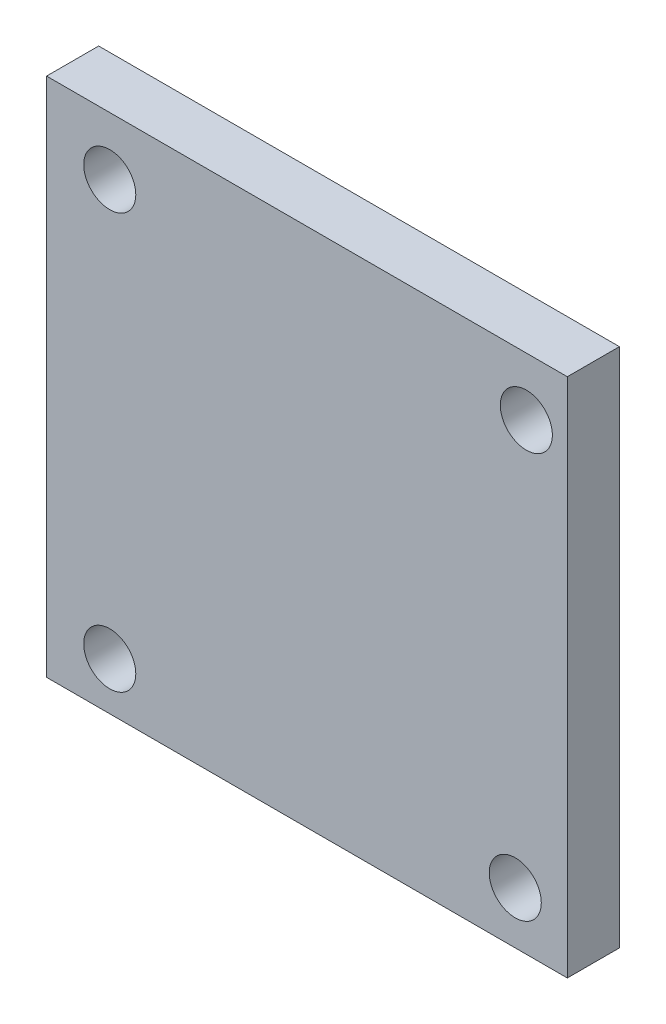
ISO-10303-21;
HEADER;
FILE_DESCRIPTION(('STEP AP214'),'2;1');
FILE_NAME('part.step','',(''),(''),'','','');
FILE_SCHEMA(('AUTOMOTIVE_DESIGN { 1 0 10303 214 1 1 1 1 }'));
ENDSEC;
DATA;
#1=APPLICATION_CONTEXT('core data for automotive mechanical design processes');
#2=APPLICATION_PROTOCOL_DEFINITION('international standard','automotive_design',2000,#1);
#3=PRODUCT_CONTEXT('',#1,'mechanical');
#4=PRODUCT('Part','Part','',(#3));
#5=PRODUCT_RELATED_PRODUCT_CATEGORY('part','',(#4));
#6=PRODUCT_DEFINITION_FORMATION('','',#4);
#7=PRODUCT_DEFINITION_CONTEXT('part definition',#1,'design');
#8=PRODUCT_DEFINITION('design','',#6,#7);
#9=PRODUCT_DEFINITION_SHAPE('','',#8);
#10=(LENGTH_UNIT() NAMED_UNIT(*) SI_UNIT(.MILLI.,.METRE.));
#11=(NAMED_UNIT(*) PLANE_ANGLE_UNIT() SI_UNIT($,.RADIAN.));
#12=(NAMED_UNIT(*) SI_UNIT($,.STERADIAN.) SOLID_ANGLE_UNIT());
#13=UNCERTAINTY_MEASURE_WITH_UNIT(LENGTH_MEASURE(1.E-05),#10,'distance_accuracy_value','');
#14=(GEOMETRIC_REPRESENTATION_CONTEXT(3) GLOBAL_UNCERTAINTY_ASSIGNED_CONTEXT((#13)) GLOBAL_UNIT_ASSIGNED_CONTEXT((#10,
#11,#12)) REPRESENTATION_CONTEXT('',''));
#15=CARTESIAN_POINT('',(0.,0.,0.));
#16=DIRECTION('',(0.,0.,1.));
#17=DIRECTION('',(1.,0.,0.));
#18=AXIS2_PLACEMENT_3D('',#15,#16,#17);
#19=CARTESIAN_POINT('',(0.,0.,5.));
#20=DIRECTION('',(0.,0.,-1.));
#21=DIRECTION('',(-1.,0.,0.));
#22=AXIS2_PLACEMENT_3D('',#19,#20,#21);
#23=PLANE('',#22);
#24=DIRECTION('',(-1.,0.,0.));
#25=VECTOR('',#24,1.);
#26=CARTESIAN_POINT('',(-41.9294217136945,28.1345836434331,5.));
#27=LINE('',#26,#25);
#28=CARTESIAN_POINT('',(8.07057828630551,28.1345836434331,5.));
#29=VERTEX_POINT('',#28);
#30=CARTESIAN_POINT('',(-41.9294217136945,28.1345836434331,5.));
#31=VERTEX_POINT('',#30);
#32=EDGE_CURVE('E89',#29,#31,#27,.T.);
#33=ORIENTED_EDGE('',*,*,#32,.T.);
#34=DIRECTION('',(0.,-1.,0.));
#35=VECTOR('',#34,1.);
#36=CARTESIAN_POINT('',(-41.9294217136945,28.1345836434331,5.));
#37=LINE('',#36,#35);
#38=CARTESIAN_POINT('',(-41.9294217136945,-21.8654163565669,5.));
#39=VERTEX_POINT('',#38);
#40=EDGE_CURVE('E84',#31,#39,#37,.T.);
#41=ORIENTED_EDGE('',*,*,#40,.T.);
#42=DIRECTION('',(1.,0.,0.));
#43=VECTOR('',#42,1.);
#44=CARTESIAN_POINT('',(-41.9294217136945,-21.8654163565669,5.));
#45=LINE('',#44,#43);
#46=CARTESIAN_POINT('',(8.07057828630552,-21.8654163565669,5.));
#47=VERTEX_POINT('',#46);
#48=EDGE_CURVE('E87',#39,#47,#45,.T.);
#49=ORIENTED_EDGE('',*,*,#48,.T.);
#50=DIRECTION('',(0.,1.,0.));
#51=VECTOR('',#50,1.);
#52=CARTESIAN_POINT('',(8.07057828630551,28.1345836434331,5.));
#53=LINE('',#52,#51);
#54=EDGE_CURVE('E54',#47,#29,#53,.T.);
#55=ORIENTED_EDGE('',*,*,#54,.T.);
#56=EDGE_LOOP('',(#33,#41,#49,#55));
#57=FACE_BOUND('',#56,.T.);
#58=CARTESIAN_POINT('',(-35.8653319610181,22.5569821266824,5.));
#59=DIRECTION('',(0.,0.,1.));
#60=DIRECTION('',(1.,0.,0.));
#61=AXIS2_PLACEMENT_3D('',#58,#59,#60);
#62=CIRCLE('',#61,2.5);
#63=CARTESIAN_POINT('',(-33.3653319610181,22.5569821266824,5.));
#64=VERTEX_POINT('',#63);
#65=EDGE_CURVE('E104',#64,#64,#62,.T.);
#66=ORIENTED_EDGE('',*,*,#65,.F.);
#67=EDGE_LOOP('',(#66));
#68=FACE_BOUND('',#67,.T.);
#69=CARTESIAN_POINT('',(-35.8653319610181,-17.2885203847168,5.));
#70=DIRECTION('',(0.,0.,1.));
#71=DIRECTION('',(1.,0.,0.));
#72=AXIS2_PLACEMENT_3D('',#69,#70,#71);
#73=CIRCLE('',#72,2.5);
#74=CARTESIAN_POINT('',(-33.3653319610181,-17.2885203847168,5.));
#75=VERTEX_POINT('',#74);
#76=EDGE_CURVE('E119',#75,#75,#73,.T.);
#77=ORIENTED_EDGE('',*,*,#76,.F.);
#78=EDGE_LOOP('',(#77));
#79=FACE_BOUND('',#78,.T.);
#80=CARTESIAN_POINT('',(4.13466803898184,22.5569821266824,5.));
#81=DIRECTION('',(0.,0.,1.));
#82=DIRECTION('',(1.,0.,0.));
#83=AXIS2_PLACEMENT_3D('',#80,#81,#82);
#84=CIRCLE('',#83,2.5);
#85=CARTESIAN_POINT('',(6.63466803898185,22.5569821266824,5.));
#86=VERTEX_POINT('',#85);
#87=EDGE_CURVE('E125',#86,#86,#84,.T.);
#88=ORIENTED_EDGE('',*,*,#87,.F.);
#89=EDGE_LOOP('',(#88));
#90=FACE_BOUND('',#89,.T.);
#91=CARTESIAN_POINT('',(3.07057828630552,-16.8654163565669,5.));
#92=DIRECTION('',(0.,0.,1.));
#93=DIRECTION('',(1.,0.,0.));
#94=AXIS2_PLACEMENT_3D('',#91,#92,#93);
#95=CIRCLE('',#94,2.5);
#96=CARTESIAN_POINT('',(5.57057828630552,-16.8654163565669,5.));
#97=VERTEX_POINT('',#96);
#98=EDGE_CURVE('E131',#97,#97,#95,.T.);
#99=ORIENTED_EDGE('',*,*,#98,.F.);
#100=EDGE_LOOP('',(#99));
#101=FACE_BOUND('',#100,.T.);
#102=ADVANCED_FACE('F37',(#57,#68,#79,#90,#101),#23,.F.);
#103=CARTESIAN_POINT('',(0.,0.,0.));
#104=DIRECTION('',(0.,0.,-1.));
#105=DIRECTION('',(-1.,0.,0.));
#106=AXIS2_PLACEMENT_3D('',#103,#104,#105);
#107=PLANE('',#106);
#108=CARTESIAN_POINT('',(4.13466803898184,22.5569821266824,0.));
#109=DIRECTION('',(0.,0.,1.));
#110=DIRECTION('',(1.,0.,0.));
#111=AXIS2_PLACEMENT_3D('',#108,#109,#110);
#112=CIRCLE('',#111,2.5);
#113=CARTESIAN_POINT('',(6.63466803898185,22.5569821266824,0.));
#114=VERTEX_POINT('',#113);
#115=EDGE_CURVE('E128',#114,#114,#112,.T.);
#116=ORIENTED_EDGE('',*,*,#115,.T.);
#117=EDGE_LOOP('',(#116));
#118=FACE_BOUND('',#117,.T.);
#119=CARTESIAN_POINT('',(-35.8653319610181,22.5569821266824,0.));
#120=DIRECTION('',(0.,0.,1.));
#121=DIRECTION('',(1.,0.,0.));
#122=AXIS2_PLACEMENT_3D('',#119,#120,#121);
#123=CIRCLE('',#122,2.5);
#124=CARTESIAN_POINT('',(-33.3653319610181,22.5569821266824,0.));
#125=VERTEX_POINT('',#124);
#126=EDGE_CURVE('E116',#125,#125,#123,.T.);
#127=ORIENTED_EDGE('',*,*,#126,.T.);
#128=EDGE_LOOP('',(#127));
#129=FACE_BOUND('',#128,.T.);
#130=DIRECTION('',(-1.,0.,0.));
#131=VECTOR('',#130,1.);
#132=CARTESIAN_POINT('',(-41.9294217136945,28.1345836434331,0.));
#133=LINE('',#132,#131);
#134=CARTESIAN_POINT('',(8.07057828630551,28.1345836434331,0.));
#135=VERTEX_POINT('',#134);
#136=CARTESIAN_POINT('',(-41.9294217136945,28.1345836434331,0.));
#137=VERTEX_POINT('',#136);
#138=EDGE_CURVE('E101',#135,#137,#133,.T.);
#139=ORIENTED_EDGE('',*,*,#138,.F.);
#140=DIRECTION('',(0.,1.,0.));
#141=VECTOR('',#140,1.);
#142=CARTESIAN_POINT('',(8.07057828630551,28.1345836434331,0.));
#143=LINE('',#142,#141);
#144=CARTESIAN_POINT('',(8.07057828630552,-21.8654163565669,0.));
#145=VERTEX_POINT('',#144);
#146=EDGE_CURVE('E77',#145,#135,#143,.T.);
#147=ORIENTED_EDGE('',*,*,#146,.F.);
#148=DIRECTION('',(1.,0.,0.));
#149=VECTOR('',#148,1.);
#150=CARTESIAN_POINT('',(-41.9294217136945,-21.8654163565669,0.));
#151=LINE('',#150,#149);
#152=CARTESIAN_POINT('',(-41.9294217136945,-21.8654163565669,0.));
#153=VERTEX_POINT('',#152);
#154=EDGE_CURVE('E71',#153,#145,#151,.T.);
#155=ORIENTED_EDGE('',*,*,#154,.F.);
#156=DIRECTION('',(0.,-1.,0.));
#157=VECTOR('',#156,1.);
#158=CARTESIAN_POINT('',(-41.9294217136945,28.1345836434331,0.));
#159=LINE('',#158,#157);
#160=EDGE_CURVE('E93',#137,#153,#159,.T.);
#161=ORIENTED_EDGE('',*,*,#160,.F.);
#162=EDGE_LOOP('',(#139,#147,#155,#161));
#163=FACE_BOUND('',#162,.T.);
#164=CARTESIAN_POINT('',(-35.8653319610181,-17.2885203847168,0.));
#165=DIRECTION('',(0.,0.,1.));
#166=DIRECTION('',(1.,0.,0.));
#167=AXIS2_PLACEMENT_3D('',#164,#165,#166);
#168=CIRCLE('',#167,2.5);
#169=CARTESIAN_POINT('',(-33.3653319610181,-17.2885203847168,0.));
#170=VERTEX_POINT('',#169);
#171=EDGE_CURVE('E122',#170,#170,#168,.T.);
#172=ORIENTED_EDGE('',*,*,#171,.T.);
#173=EDGE_LOOP('',(#172));
#174=FACE_BOUND('',#173,.T.);
#175=CARTESIAN_POINT('',(3.07057828630552,-16.8654163565669,0.));
#176=DIRECTION('',(0.,0.,1.));
#177=DIRECTION('',(1.,0.,0.));
#178=AXIS2_PLACEMENT_3D('',#175,#176,#177);
#179=CIRCLE('',#178,2.5);
#180=CARTESIAN_POINT('',(5.57057828630552,-16.8654163565669,0.));
#181=VERTEX_POINT('',#180);
#182=EDGE_CURVE('E134',#181,#181,#179,.T.);
#183=ORIENTED_EDGE('',*,*,#182,.T.);
#184=EDGE_LOOP('',(#183));
#185=FACE_BOUND('',#184,.T.);
#186=ADVANCED_FACE('F112',(#118,#129,#163,#174,#185),#107,.T.);
#187=CARTESIAN_POINT('',(-41.9294217136945,28.1345836434331,5.));
#188=DIRECTION('',(0.,-1.,0.));
#189=DIRECTION('',(0.,0.,-1.));
#190=AXIS2_PLACEMENT_3D('',#187,#188,#189);
#191=PLANE('',#190);
#192=ORIENTED_EDGE('',*,*,#138,.T.);
#193=DIRECTION('',(0.,0.,-1.));
#194=VECTOR('',#193,1.);
#195=CARTESIAN_POINT('',(-41.9294217136945,28.1345836434331,5.));
#196=LINE('',#195,#194);
#197=EDGE_CURVE('E11',#31,#137,#196,.T.);
#198=ORIENTED_EDGE('',*,*,#197,.F.);
#199=ORIENTED_EDGE('',*,*,#32,.F.);
#200=DIRECTION('',(0.,0.,-1.));
#201=VECTOR('',#200,1.);
#202=CARTESIAN_POINT('',(8.07057828630551,28.1345836434331,5.));
#203=LINE('',#202,#201);
#204=EDGE_CURVE('E97',#29,#135,#203,.T.);
#205=ORIENTED_EDGE('',*,*,#204,.T.);
#206=EDGE_LOOP('',(#192,#198,#199,#205));
#207=FACE_BOUND('',#206,.T.);
#208=ADVANCED_FACE('F39',(#207),#191,.F.);
#209=CARTESIAN_POINT('',(-41.9294217136945,28.1345836434331,5.));
#210=DIRECTION('',(1.,0.,0.));
#211=DIRECTION('',(0.,1.,0.));
#212=AXIS2_PLACEMENT_3D('',#209,#210,#211);
#213=PLANE('',#212);
#214=ORIENTED_EDGE('',*,*,#160,.T.);
#215=DIRECTION('',(0.,0.,-1.));
#216=VECTOR('',#215,1.);
#217=CARTESIAN_POINT('',(-41.9294217136945,-21.8654163565669,5.));
#218=LINE('',#217,#216);
#219=EDGE_CURVE('E46',#39,#153,#218,.T.);
#220=ORIENTED_EDGE('',*,*,#219,.F.);
#221=ORIENTED_EDGE('',*,*,#40,.F.);
#222=ORIENTED_EDGE('',*,*,#197,.T.);
#223=EDGE_LOOP('',(#214,#220,#221,#222));
#224=FACE_BOUND('',#223,.T.);
#225=ADVANCED_FACE('F92',(#224),#213,.F.);
#226=CARTESIAN_POINT('',(-41.9294217136945,-21.8654163565669,5.));
#227=DIRECTION('',(0.,1.,0.));
#228=DIRECTION('',(-1.,0.,0.));
#229=AXIS2_PLACEMENT_3D('',#226,#227,#228);
#230=PLANE('',#229);
#231=ORIENTED_EDGE('',*,*,#154,.T.);
#232=DIRECTION('',(0.,0.,-1.));
#233=VECTOR('',#232,1.);
#234=CARTESIAN_POINT('',(8.07057828630552,-21.8654163565669,5.));
#235=LINE('',#234,#233);
#236=EDGE_CURVE('E94',#47,#145,#235,.T.);
#237=ORIENTED_EDGE('',*,*,#236,.F.);
#238=ORIENTED_EDGE('',*,*,#48,.F.);
#239=ORIENTED_EDGE('',*,*,#219,.T.);
#240=EDGE_LOOP('',(#231,#237,#238,#239));
#241=FACE_BOUND('',#240,.T.);
#242=ADVANCED_FACE('F95',(#241),#230,.F.);
#243=CARTESIAN_POINT('',(8.07057828630551,28.1345836434331,5.));
#244=DIRECTION('',(-1.,0.,0.));
#245=DIRECTION('',(0.,-1.,0.));
#246=AXIS2_PLACEMENT_3D('',#243,#244,#245);
#247=PLANE('',#246);
#248=ORIENTED_EDGE('',*,*,#146,.T.);
#249=ORIENTED_EDGE('',*,*,#204,.F.);
#250=ORIENTED_EDGE('',*,*,#54,.F.);
#251=ORIENTED_EDGE('',*,*,#236,.T.);
#252=EDGE_LOOP('',(#248,#249,#250,#251));
#253=FACE_BOUND('',#252,.T.);
#254=ADVANCED_FACE('F109',(#253),#247,.F.);
#255=CARTESIAN_POINT('',(-35.8653319610181,22.5569821266824,5.));
#256=DIRECTION('',(0.,0.,-1.));
#257=DIRECTION('',(-1.,0.,0.));
#258=AXIS2_PLACEMENT_3D('',#255,#256,#257);
#259=CYLINDRICAL_SURFACE('',#258,2.5);
#260=ORIENTED_EDGE('',*,*,#65,.T.);
#261=EDGE_LOOP('',(#260));
#262=FACE_BOUND('',#261,.T.);
#263=ORIENTED_EDGE('',*,*,#126,.F.);
#264=EDGE_LOOP('',(#263));
#265=FACE_BOUND('',#264,.T.);
#266=ADVANCED_FACE('F151',(#262,#265),#259,.F.);
#267=CARTESIAN_POINT('',(-35.8653319610181,-17.2885203847168,5.));
#268=DIRECTION('',(0.,0.,-1.));
#269=DIRECTION('',(-1.,0.,0.));
#270=AXIS2_PLACEMENT_3D('',#267,#268,#269);
#271=CYLINDRICAL_SURFACE('',#270,2.5);
#272=ORIENTED_EDGE('',*,*,#76,.T.);
#273=EDGE_LOOP('',(#272));
#274=FACE_BOUND('',#273,.T.);
#275=ORIENTED_EDGE('',*,*,#171,.F.);
#276=EDGE_LOOP('',(#275));
#277=FACE_BOUND('',#276,.T.);
#278=ADVANCED_FACE('F196',(#274,#277),#271,.F.);
#279=CARTESIAN_POINT('',(4.13466803898184,22.5569821266824,5.));
#280=DIRECTION('',(0.,0.,-1.));
#281=DIRECTION('',(-1.,0.,0.));
#282=AXIS2_PLACEMENT_3D('',#279,#280,#281);
#283=CYLINDRICAL_SURFACE('',#282,2.5);
#284=ORIENTED_EDGE('',*,*,#87,.T.);
#285=EDGE_LOOP('',(#284));
#286=FACE_BOUND('',#285,.T.);
#287=ORIENTED_EDGE('',*,*,#115,.F.);
#288=EDGE_LOOP('',(#287));
#289=FACE_BOUND('',#288,.T.);
#290=ADVANCED_FACE('F204',(#286,#289),#283,.F.);
#291=CARTESIAN_POINT('',(3.07057828630552,-16.8654163565669,5.));
#292=DIRECTION('',(0.,0.,-1.));
#293=DIRECTION('',(-1.,0.,0.));
#294=AXIS2_PLACEMENT_3D('',#291,#292,#293);
#295=CYLINDRICAL_SURFACE('',#294,2.5);
#296=ORIENTED_EDGE('',*,*,#98,.T.);
#297=EDGE_LOOP('',(#296));
#298=FACE_BOUND('',#297,.T.);
#299=ORIENTED_EDGE('',*,*,#182,.F.);
#300=EDGE_LOOP('',(#299));
#301=FACE_BOUND('',#300,.T.);
#302=ADVANCED_FACE('F140',(#298,#301),#295,.F.);
#303=CLOSED_SHELL('',(#102,#186,#208,#225,#242,#254,#266,#278,#290,#302));
#304=MANIFOLD_SOLID_BREP('B2',#303);
#305=ADVANCED_BREP_SHAPE_REPRESENTATION('',(#18,#304),#14);
#306=SHAPE_DEFINITION_REPRESENTATION(#9,#305);
ENDSEC;
END-ISO-10303-21;
